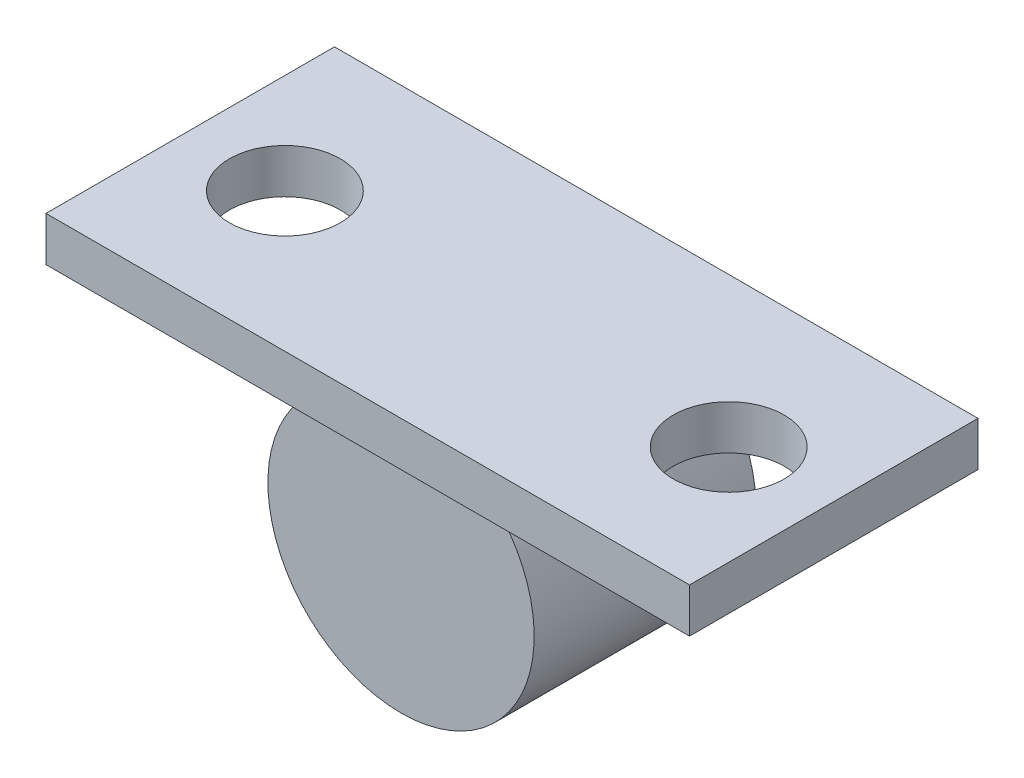
ISO-10303-21;
HEADER;
FILE_DESCRIPTION(('STEP AP214'),'2;1');
FILE_NAME('part.step','',(''),(''),'','','');
FILE_SCHEMA(('AUTOMOTIVE_DESIGN { 1 0 10303 214 1 1 1 1 }'));
ENDSEC;
DATA;
#1=APPLICATION_CONTEXT('core data for automotive mechanical design processes');
#2=APPLICATION_PROTOCOL_DEFINITION('international standard','automotive_design',2000,#1);
#3=PRODUCT_CONTEXT('',#1,'mechanical');
#4=PRODUCT('Part','Part','',(#3));
#5=PRODUCT_RELATED_PRODUCT_CATEGORY('part','',(#4));
#6=PRODUCT_DEFINITION_FORMATION('','',#4);
#7=PRODUCT_DEFINITION_CONTEXT('part definition',#1,'design');
#8=PRODUCT_DEFINITION('design','',#6,#7);
#9=PRODUCT_DEFINITION_SHAPE('','',#8);
#10=(LENGTH_UNIT() NAMED_UNIT(*) SI_UNIT(.MILLI.,.METRE.));
#11=(NAMED_UNIT(*) PLANE_ANGLE_UNIT() SI_UNIT($,.RADIAN.));
#12=(NAMED_UNIT(*) SI_UNIT($,.STERADIAN.) SOLID_ANGLE_UNIT());
#13=UNCERTAINTY_MEASURE_WITH_UNIT(LENGTH_MEASURE(1.E-05),#10,'distance_accuracy_value','');
#14=(GEOMETRIC_REPRESENTATION_CONTEXT(3) GLOBAL_UNCERTAINTY_ASSIGNED_CONTEXT((#13)) GLOBAL_UNIT_ASSIGNED_CONTEXT((#10,
#11,#12)) REPRESENTATION_CONTEXT('',''));
#15=CARTESIAN_POINT('',(0.,0.,0.));
#16=DIRECTION('',(0.,0.,1.));
#17=DIRECTION('',(1.,0.,0.));
#18=AXIS2_PLACEMENT_3D('',#15,#16,#17);
#19=CARTESIAN_POINT('',(14.5,-2.,-6.5));
#20=DIRECTION('',(1.,0.,0.));
#21=DIRECTION('',(0.,0.,-1.));
#22=AXIS2_PLACEMENT_3D('',#19,#20,#21);
#23=PLANE('',#22);
#24=DIRECTION('',(0.,0.,-1.));
#25=VECTOR('',#24,1.);
#26=CARTESIAN_POINT('',(14.5,0.,-6.5));
#27=LINE('',#26,#25);
#28=CARTESIAN_POINT('',(14.5,0.,6.5));
#29=VERTEX_POINT('',#28);
#30=CARTESIAN_POINT('',(14.5,0.,-6.5));
#31=VERTEX_POINT('',#30);
#32=EDGE_CURVE('E108',#29,#31,#27,.T.);
#33=ORIENTED_EDGE('',*,*,#32,.F.);
#34=DIRECTION('',(0.,1.,0.));
#35=VECTOR('',#34,1.);
#36=CARTESIAN_POINT('',(14.5,-2.,6.5));
#37=LINE('',#36,#35);
#38=CARTESIAN_POINT('',(14.5,-2.,6.5));
#39=VERTEX_POINT('',#38);
#40=EDGE_CURVE('E98',#39,#29,#37,.T.);
#41=ORIENTED_EDGE('',*,*,#40,.F.);
#42=DIRECTION('',(0.,0.,-1.));
#43=VECTOR('',#42,1.);
#44=CARTESIAN_POINT('',(14.5,-2.,-6.5));
#45=LINE('',#44,#43);
#46=CARTESIAN_POINT('',(14.5,-2.,-6.5));
#47=VERTEX_POINT('',#46);
#48=EDGE_CURVE('E120',#39,#47,#45,.T.);
#49=ORIENTED_EDGE('',*,*,#48,.T.);
#50=DIRECTION('',(0.,1.,0.));
#51=VECTOR('',#50,1.);
#52=CARTESIAN_POINT('',(14.5,-2.,-6.5));
#53=LINE('',#52,#51);
#54=EDGE_CURVE('E132',#47,#31,#53,.T.);
#55=ORIENTED_EDGE('',*,*,#54,.T.);
#56=EDGE_LOOP('',(#33,#41,#49,#55));
#57=FACE_BOUND('',#56,.T.);
#58=ADVANCED_FACE('F41',(#57),#23,.T.);
#59=CARTESIAN_POINT('',(-14.5,-2.,6.5));
#60=DIRECTION('',(0.,0.,1.));
#61=DIRECTION('',(1.,0.,0.));
#62=AXIS2_PLACEMENT_3D('',#59,#60,#61);
#63=PLANE('',#62);
#64=DIRECTION('',(1.,0.,0.));
#65=VECTOR('',#64,1.);
#66=CARTESIAN_POINT('',(-14.5,0.,6.5));
#67=LINE('',#66,#65);
#68=CARTESIAN_POINT('',(-14.5,0.,6.5));
#69=VERTEX_POINT('',#68);
#70=EDGE_CURVE('E121',#69,#29,#67,.T.);
#71=ORIENTED_EDGE('',*,*,#70,.F.);
#72=DIRECTION('',(0.,1.,0.));
#73=VECTOR('',#72,1.);
#74=CARTESIAN_POINT('',(-14.5,-2.,6.5));
#75=LINE('',#74,#73);
#76=CARTESIAN_POINT('',(-14.5,-2.,6.5));
#77=VERTEX_POINT('',#76);
#78=EDGE_CURVE('E141',#77,#69,#75,.T.);
#79=ORIENTED_EDGE('',*,*,#78,.F.);
#80=DIRECTION('',(1.,0.,0.));
#81=VECTOR('',#80,1.);
#82=CARTESIAN_POINT('',(-14.5,-2.,6.5));
#83=LINE('',#82,#81);
#84=EDGE_CURVE('E126',#77,#39,#83,.T.);
#85=ORIENTED_EDGE('',*,*,#84,.T.);
#86=ORIENTED_EDGE('',*,*,#40,.T.);
#87=EDGE_LOOP('',(#71,#79,#85,#86));
#88=FACE_BOUND('',#87,.T.);
#89=ADVANCED_FACE('F159',(#88),#63,.T.);
#90=CARTESIAN_POINT('',(-14.5,-2.,-6.5));
#91=DIRECTION('',(-1.,0.,0.));
#92=DIRECTION('',(0.,0.,1.));
#93=AXIS2_PLACEMENT_3D('',#90,#91,#92);
#94=PLANE('',#93);
#95=DIRECTION('',(0.,0.,1.));
#96=VECTOR('',#95,1.);
#97=CARTESIAN_POINT('',(-14.5,0.,-6.5));
#98=LINE('',#97,#96);
#99=CARTESIAN_POINT('',(-14.5,0.,-6.5));
#100=VERTEX_POINT('',#99);
#101=EDGE_CURVE('E136',#100,#69,#98,.T.);
#102=ORIENTED_EDGE('',*,*,#101,.F.);
#103=DIRECTION('',(0.,1.,0.));
#104=VECTOR('',#103,1.);
#105=CARTESIAN_POINT('',(-14.5,-2.,-6.5));
#106=LINE('',#105,#104);
#107=CARTESIAN_POINT('',(-14.5,-2.,-6.5));
#108=VERTEX_POINT('',#107);
#109=EDGE_CURVE('E144',#108,#100,#106,.T.);
#110=ORIENTED_EDGE('',*,*,#109,.F.);
#111=DIRECTION('',(0.,0.,1.));
#112=VECTOR('',#111,1.);
#113=CARTESIAN_POINT('',(-14.5,-2.,-6.5));
#114=LINE('',#113,#112);
#115=EDGE_CURVE('E122',#108,#77,#114,.T.);
#116=ORIENTED_EDGE('',*,*,#115,.T.);
#117=ORIENTED_EDGE('',*,*,#78,.T.);
#118=EDGE_LOOP('',(#102,#110,#116,#117));
#119=FACE_BOUND('',#118,.T.);
#120=ADVANCED_FACE('F164',(#119),#94,.T.);
#121=CARTESIAN_POINT('',(-14.5,-2.,-6.5));
#122=DIRECTION('',(0.,0.,-1.));
#123=DIRECTION('',(-1.,0.,0.));
#124=AXIS2_PLACEMENT_3D('',#121,#122,#123);
#125=PLANE('',#124);
#126=DIRECTION('',(-1.,0.,0.));
#127=VECTOR('',#126,1.);
#128=CARTESIAN_POINT('',(-14.5,0.,-6.5));
#129=LINE('',#128,#127);
#130=EDGE_CURVE('E131',#31,#100,#129,.T.);
#131=ORIENTED_EDGE('',*,*,#130,.F.);
#132=ORIENTED_EDGE('',*,*,#54,.F.);
#133=DIRECTION('',(-1.,0.,0.));
#134=VECTOR('',#133,1.);
#135=CARTESIAN_POINT('',(-14.5,-2.,-6.5));
#136=LINE('',#135,#134);
#137=EDGE_CURVE('E124',#47,#108,#136,.T.);
#138=ORIENTED_EDGE('',*,*,#137,.T.);
#139=ORIENTED_EDGE('',*,*,#109,.T.);
#140=EDGE_LOOP('',(#131,#132,#138,#139));
#141=FACE_BOUND('',#140,.T.);
#142=ADVANCED_FACE('F152',(#141),#125,.T.);
#143=CARTESIAN_POINT('',(0.,-2.,0.));
#144=DIRECTION('',(0.,1.,0.));
#145=DIRECTION('',(0.,0.,1.));
#146=AXIS2_PLACEMENT_3D('',#143,#144,#145);
#147=PLANE('',#146);
#148=DIRECTION('',(0.,0.,-1.));
#149=VECTOR('',#148,1.);
#150=CARTESIAN_POINT('',(-3.3166247903554,-2.,5.));
#151=LINE('',#150,#149);
#152=CARTESIAN_POINT('',(-3.3166247903554,-2.,5.));
#153=VERTEX_POINT('',#152);
#154=CARTESIAN_POINT('',(-3.3166247903554,-2.,-5.));
#155=VERTEX_POINT('',#154);
#156=EDGE_CURVE('E59',#153,#155,#151,.T.);
#157=ORIENTED_EDGE('',*,*,#156,.F.);
#158=DIRECTION('',(1.,0.,0.));
#159=VECTOR('',#158,1.);
#160=CARTESIAN_POINT('',(0.,-2.,5.));
#161=LINE('',#160,#159);
#162=CARTESIAN_POINT('',(3.3166247903554,-2.,5.));
#163=VERTEX_POINT('',#162);
#164=EDGE_CURVE('E11',#153,#163,#161,.T.);
#165=ORIENTED_EDGE('',*,*,#164,.T.);
#166=DIRECTION('',(0.,0.,-1.));
#167=VECTOR('',#166,1.);
#168=CARTESIAN_POINT('',(3.3166247903554,-2.,5.));
#169=LINE('',#168,#167);
#170=CARTESIAN_POINT('',(3.3166247903554,-2.,-5.));
#171=VERTEX_POINT('',#170);
#172=EDGE_CURVE('E48',#171,#163,#169,.F.);
#173=ORIENTED_EDGE('',*,*,#172,.F.);
#174=DIRECTION('',(1.,0.,0.));
#175=VECTOR('',#174,1.);
#176=CARTESIAN_POINT('',(0.,-2.,-5.));
#177=LINE('',#176,#175);
#178=EDGE_CURVE('E90',#155,#171,#177,.T.);
#179=ORIENTED_EDGE('',*,*,#178,.F.);
#180=EDGE_LOOP('',(#157,#165,#173,#179));
#181=FACE_BOUND('',#180,.T.);
#182=CARTESIAN_POINT('',(-10.,-2.,0.23499538868469));
#183=DIRECTION('',(0.,1.,0.));
#184=DIRECTION('',(0.,0.,1.));
#185=AXIS2_PLACEMENT_3D('',#182,#183,#184);
#186=CIRCLE('',#185,2.5);
#187=CARTESIAN_POINT('',(-10.,-2.,2.73499538868469));
#188=VERTEX_POINT('',#187);
#189=EDGE_CURVE('E106',#188,#188,#186,.T.);
#190=ORIENTED_EDGE('',*,*,#189,.T.);
#191=EDGE_LOOP('',(#190));
#192=FACE_BOUND('',#191,.T.);
#193=CARTESIAN_POINT('',(10.,-2.,0.23499538868469));
#194=DIRECTION('',(0.,1.,0.));
#195=DIRECTION('',(0.,0.,-1.));
#196=AXIS2_PLACEMENT_3D('',#193,#194,#195);
#197=CIRCLE('',#196,2.5);
#198=CARTESIAN_POINT('',(10.,-2.,-2.26500461131531));
#199=VERTEX_POINT('',#198);
#200=EDGE_CURVE('E103',#199,#199,#197,.T.);
#201=ORIENTED_EDGE('',*,*,#200,.T.);
#202=EDGE_LOOP('',(#201));
#203=FACE_BOUND('',#202,.T.);
#204=ORIENTED_EDGE('',*,*,#48,.F.);
#205=ORIENTED_EDGE('',*,*,#84,.F.);
#206=ORIENTED_EDGE('',*,*,#115,.F.);
#207=ORIENTED_EDGE('',*,*,#137,.F.);
#208=EDGE_LOOP('',(#204,#205,#206,#207));
#209=FACE_BOUND('',#208,.T.);
#210=ADVANCED_FACE('F87',(#181,#192,#203,#209),#147,.F.);
#211=CARTESIAN_POINT('',(0.,0.,0.));
#212=DIRECTION('',(0.,1.,0.));
#213=DIRECTION('',(0.,0.,1.));
#214=AXIS2_PLACEMENT_3D('',#211,#212,#213);
#215=PLANE('',#214);
#216=CARTESIAN_POINT('',(-10.,0.,0.23499538868469));
#217=DIRECTION('',(0.,1.,0.));
#218=DIRECTION('',(0.,0.,1.));
#219=AXIS2_PLACEMENT_3D('',#216,#217,#218);
#220=CIRCLE('',#219,2.5);
#221=CARTESIAN_POINT('',(-10.,0.,2.73499538868469));
#222=VERTEX_POINT('',#221);
#223=EDGE_CURVE('E109',#222,#222,#220,.T.);
#224=ORIENTED_EDGE('',*,*,#223,.F.);
#225=EDGE_LOOP('',(#224));
#226=FACE_BOUND('',#225,.T.);
#227=CARTESIAN_POINT('',(10.,0.,0.23499538868469));
#228=DIRECTION('',(0.,1.,0.));
#229=DIRECTION('',(0.,0.,-1.));
#230=AXIS2_PLACEMENT_3D('',#227,#228,#229);
#231=CIRCLE('',#230,2.5);
#232=CARTESIAN_POINT('',(10.,0.,-2.26500461131531));
#233=VERTEX_POINT('',#232);
#234=EDGE_CURVE('E114',#233,#233,#231,.T.);
#235=ORIENTED_EDGE('',*,*,#234,.F.);
#236=EDGE_LOOP('',(#235));
#237=FACE_BOUND('',#236,.T.);
#238=ORIENTED_EDGE('',*,*,#32,.T.);
#239=ORIENTED_EDGE('',*,*,#130,.T.);
#240=ORIENTED_EDGE('',*,*,#101,.T.);
#241=ORIENTED_EDGE('',*,*,#70,.T.);
#242=EDGE_LOOP('',(#238,#239,#240,#241));
#243=FACE_BOUND('',#242,.T.);
#244=ADVANCED_FACE('F160',(#226,#237,#243),#215,.T.);
#245=CARTESIAN_POINT('',(10.,-2.,0.23499538868469));
#246=DIRECTION('',(0.,1.,0.));
#247=DIRECTION('',(0.,0.,1.));
#248=AXIS2_PLACEMENT_3D('',#245,#246,#247);
#249=CYLINDRICAL_SURFACE('',#248,2.5);
#250=ORIENTED_EDGE('',*,*,#200,.F.);
#251=EDGE_LOOP('',(#250));
#252=FACE_BOUND('',#251,.T.);
#253=ORIENTED_EDGE('',*,*,#234,.T.);
#254=EDGE_LOOP('',(#253));
#255=FACE_BOUND('',#254,.T.);
#256=ADVANCED_FACE('F211',(#252,#255),#249,.F.);
#257=CARTESIAN_POINT('',(-10.,-2.,0.23499538868469));
#258=DIRECTION('',(0.,1.,0.));
#259=DIRECTION('',(0.,0.,1.));
#260=AXIS2_PLACEMENT_3D('',#257,#258,#259);
#261=CYLINDRICAL_SURFACE('',#260,2.5);
#262=ORIENTED_EDGE('',*,*,#189,.F.);
#263=EDGE_LOOP('',(#262));
#264=FACE_BOUND('',#263,.T.);
#265=ORIENTED_EDGE('',*,*,#223,.T.);
#266=EDGE_LOOP('',(#265));
#267=FACE_BOUND('',#266,.T.);
#268=ADVANCED_FACE('F222',(#264,#267),#261,.F.);
#269=CARTESIAN_POINT('',(0.,-7.,5.));
#270=DIRECTION('',(0.,0.,-1.));
#271=DIRECTION('',(-1.,0.,0.));
#272=AXIS2_PLACEMENT_3D('',#269,#270,#271);
#273=CYLINDRICAL_SURFACE('',#272,6.);
#274=CARTESIAN_POINT('',(0.,-7.,-5.));
#275=DIRECTION('',(0.,0.,1.));
#276=DIRECTION('',(1.,0.,0.));
#277=AXIS2_PLACEMENT_3D('',#274,#275,#276);
#278=CIRCLE('',#277,6.);
#279=EDGE_CURVE('E100',#155,#171,#278,.T.);
#280=ORIENTED_EDGE('',*,*,#279,.T.);
#281=ORIENTED_EDGE('',*,*,#172,.T.);
#282=CARTESIAN_POINT('',(0.,-7.,5.));
#283=DIRECTION('',(0.,0.,1.));
#284=DIRECTION('',(1.,0.,0.));
#285=AXIS2_PLACEMENT_3D('',#282,#283,#284);
#286=CIRCLE('',#285,6.);
#287=EDGE_CURVE('E101',#153,#163,#286,.T.);
#288=ORIENTED_EDGE('',*,*,#287,.F.);
#289=ORIENTED_EDGE('',*,*,#156,.T.);
#290=EDGE_LOOP('',(#280,#281,#288,#289));
#291=FACE_BOUND('',#290,.T.);
#292=ADVANCED_FACE('F99',(#291),#273,.T.);
#293=CARTESIAN_POINT('',(0.,-7.,5.));
#294=DIRECTION('',(0.,0.,1.));
#295=DIRECTION('',(1.,0.,0.));
#296=AXIS2_PLACEMENT_3D('',#293,#294,#295);
#297=PLANE('',#296);
#298=ORIENTED_EDGE('',*,*,#164,.F.);
#299=ORIENTED_EDGE('',*,*,#287,.T.);
#300=EDGE_LOOP('',(#298,#299));
#301=FACE_BOUND('',#300,.T.);
#302=ADVANCED_FACE('F236',(#301),#297,.T.);
#303=CARTESIAN_POINT('',(0.,-7.,-5.));
#304=DIRECTION('',(0.,0.,1.));
#305=DIRECTION('',(1.,0.,0.));
#306=AXIS2_PLACEMENT_3D('',#303,#304,#305);
#307=PLANE('',#306);
#308=ORIENTED_EDGE('',*,*,#279,.F.);
#309=ORIENTED_EDGE('',*,*,#178,.T.);
#310=EDGE_LOOP('',(#308,#309));
#311=FACE_BOUND('',#310,.T.);
#312=ADVANCED_FACE('F96',(#311),#307,.F.);
#313=CLOSED_SHELL('',(#58,#89,#120,#142,#210,#244,#256,#268,#292,#302,#312));
#314=MANIFOLD_SOLID_BREP('B2',#313);
#315=ADVANCED_BREP_SHAPE_REPRESENTATION('',(#18,#314),#14);
#316=SHAPE_DEFINITION_REPRESENTATION(#9,#315);
ENDSEC;
END-ISO-10303-21;
